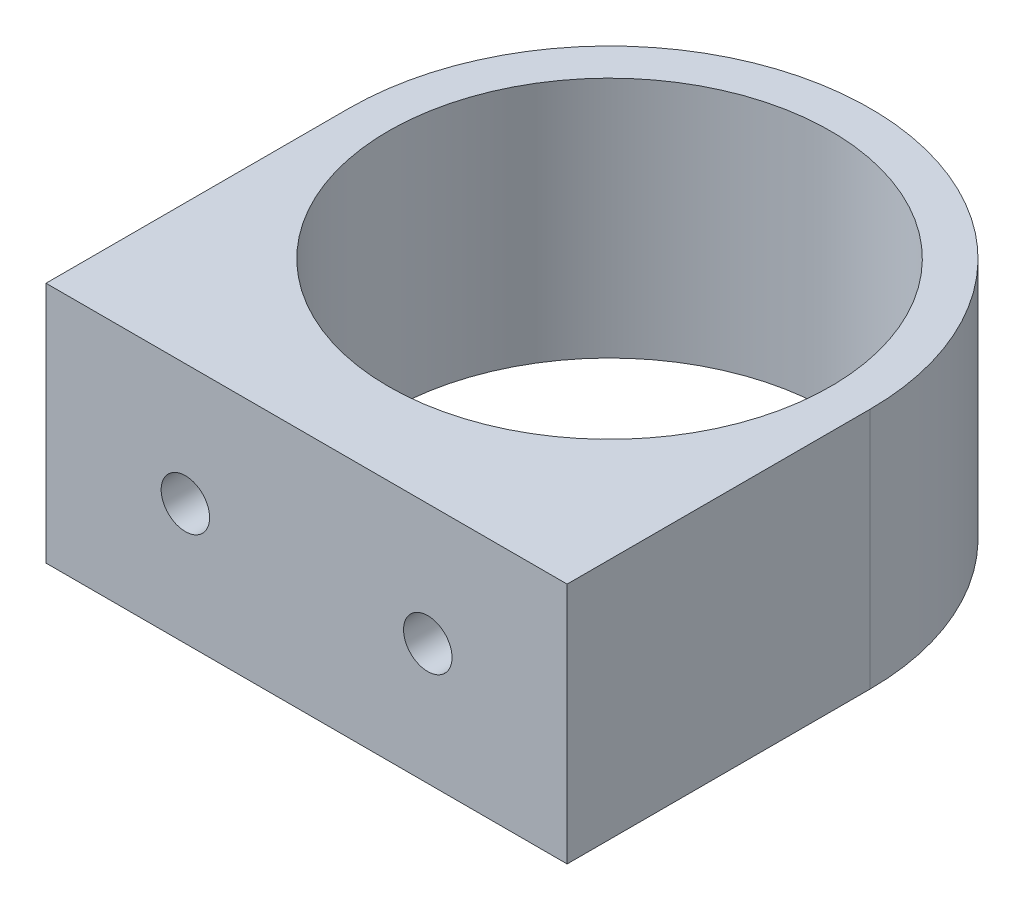
ISO-10303-21;
HEADER;
FILE_DESCRIPTION(('STEP AP214'),'2;1');
FILE_NAME('part.step','',(''),(''),'','','');
FILE_SCHEMA(('AUTOMOTIVE_DESIGN { 1 0 10303 214 1 1 1 1 }'));
ENDSEC;
DATA;
#1=APPLICATION_CONTEXT('core data for automotive mechanical design processes');
#2=APPLICATION_PROTOCOL_DEFINITION('international standard','automotive_design',2000,#1);
#3=PRODUCT_CONTEXT('',#1,'mechanical');
#4=PRODUCT('Part','Part','',(#3));
#5=PRODUCT_RELATED_PRODUCT_CATEGORY('part','',(#4));
#6=PRODUCT_DEFINITION_FORMATION('','',#4);
#7=PRODUCT_DEFINITION_CONTEXT('part definition',#1,'design');
#8=PRODUCT_DEFINITION('design','',#6,#7);
#9=PRODUCT_DEFINITION_SHAPE('','',#8);
#10=(LENGTH_UNIT() NAMED_UNIT(*) SI_UNIT(.MILLI.,.METRE.));
#11=(NAMED_UNIT(*) PLANE_ANGLE_UNIT() SI_UNIT($,.RADIAN.));
#12=(NAMED_UNIT(*) SI_UNIT($,.STERADIAN.) SOLID_ANGLE_UNIT());
#13=UNCERTAINTY_MEASURE_WITH_UNIT(LENGTH_MEASURE(1.E-05),#10,'distance_accuracy_value','');
#14=(GEOMETRIC_REPRESENTATION_CONTEXT(3) GLOBAL_UNCERTAINTY_ASSIGNED_CONTEXT((#13)) GLOBAL_UNIT_ASSIGNED_CONTEXT((#10,
#11,#12)) REPRESENTATION_CONTEXT('',''));
#15=CARTESIAN_POINT('',(0.,0.,0.));
#16=DIRECTION('',(0.,0.,1.));
#17=DIRECTION('',(1.,0.,0.));
#18=AXIS2_PLACEMENT_3D('',#15,#16,#17);
#19=CARTESIAN_POINT('',(21.5,20.,0.));
#20=DIRECTION('',(-1.,0.,0.));
#21=DIRECTION('',(0.,0.,1.));
#22=AXIS2_PLACEMENT_3D('',#19,#20,#21);
#23=PLANE('',#22);
#24=DIRECTION('',(0.,0.,-1.));
#25=VECTOR('',#24,1.);
#26=CARTESIAN_POINT('',(21.5,0.,0.));
#27=LINE('',#26,#25);
#28=CARTESIAN_POINT('',(21.5,0.,25.));
#29=VERTEX_POINT('',#28);
#30=CARTESIAN_POINT('',(21.5,0.,0.));
#31=VERTEX_POINT('',#30);
#32=EDGE_CURVE('E161',#29,#31,#27,.T.);
#33=ORIENTED_EDGE('',*,*,#32,.T.);
#34=DIRECTION('',(0.,-1.,0.));
#35=VECTOR('',#34,1.);
#36=CARTESIAN_POINT('',(21.5,20.,0.));
#37=LINE('',#36,#35);
#38=CARTESIAN_POINT('',(21.5,20.,0.));
#39=VERTEX_POINT('',#38);
#40=EDGE_CURVE('E108',#39,#31,#37,.T.);
#41=ORIENTED_EDGE('',*,*,#40,.F.);
#42=DIRECTION('',(0.,0.,-1.));
#43=VECTOR('',#42,1.);
#44=CARTESIAN_POINT('',(21.5,20.,0.));
#45=LINE('',#44,#43);
#46=CARTESIAN_POINT('',(21.5,20.,25.));
#47=VERTEX_POINT('',#46);
#48=EDGE_CURVE('E188',#47,#39,#45,.T.);
#49=ORIENTED_EDGE('',*,*,#48,.F.);
#50=DIRECTION('',(0.,-1.,0.));
#51=VECTOR('',#50,1.);
#52=CARTESIAN_POINT('',(21.5,20.,25.));
#53=LINE('',#52,#51);
#54=EDGE_CURVE('E164',#47,#29,#53,.T.);
#55=ORIENTED_EDGE('',*,*,#54,.T.);
#56=EDGE_LOOP('',(#33,#41,#49,#55));
#57=FACE_BOUND('',#56,.T.);
#58=ADVANCED_FACE('F50',(#57),#23,.F.);
#59=CARTESIAN_POINT('',(0.,20.,0.));
#60=DIRECTION('',(0.,-1.,0.));
#61=DIRECTION('',(0.,0.,-1.));
#62=AXIS2_PLACEMENT_3D('',#59,#60,#61);
#63=CYLINDRICAL_SURFACE('',#62,21.5);
#64=CARTESIAN_POINT('',(0.,0.,0.));
#65=DIRECTION('',(0.,1.,0.));
#66=DIRECTION('',(0.,0.,1.));
#67=AXIS2_PLACEMENT_3D('',#64,#65,#66);
#68=CIRCLE('',#67,21.5);
#69=CARTESIAN_POINT('',(-21.5,0.,0.));
#70=VERTEX_POINT('',#69);
#71=EDGE_CURVE('E169',#31,#70,#68,.T.);
#72=ORIENTED_EDGE('',*,*,#71,.T.);
#73=DIRECTION('',(0.,-1.,0.));
#74=VECTOR('',#73,1.);
#75=CARTESIAN_POINT('',(-21.5,20.,0.));
#76=LINE('',#75,#74);
#77=CARTESIAN_POINT('',(-21.5,20.,0.));
#78=VERTEX_POINT('',#77);
#79=EDGE_CURVE('E198',#78,#70,#76,.T.);
#80=ORIENTED_EDGE('',*,*,#79,.F.);
#81=CARTESIAN_POINT('',(0.,20.,0.));
#82=DIRECTION('',(0.,1.,0.));
#83=DIRECTION('',(0.,0.,1.));
#84=AXIS2_PLACEMENT_3D('',#81,#82,#83);
#85=CIRCLE('',#84,21.5);
#86=EDGE_CURVE('E203',#39,#78,#85,.T.);
#87=ORIENTED_EDGE('',*,*,#86,.F.);
#88=ORIENTED_EDGE('',*,*,#40,.T.);
#89=EDGE_LOOP('',(#72,#80,#87,#88));
#90=FACE_BOUND('',#89,.T.);
#91=ADVANCED_FACE('F155',(#90),#63,.T.);
#92=CARTESIAN_POINT('',(-21.5,20.,0.));
#93=DIRECTION('',(1.,0.,0.));
#94=DIRECTION('',(0.,0.,-1.));
#95=AXIS2_PLACEMENT_3D('',#92,#93,#94);
#96=PLANE('',#95);
#97=DIRECTION('',(0.,0.,1.));
#98=VECTOR('',#97,1.);
#99=CARTESIAN_POINT('',(-21.5,0.,0.));
#100=LINE('',#99,#98);
#101=CARTESIAN_POINT('',(-21.5,0.,25.));
#102=VERTEX_POINT('',#101);
#103=EDGE_CURVE('E171',#70,#102,#100,.T.);
#104=ORIENTED_EDGE('',*,*,#103,.T.);
#105=DIRECTION('',(0.,-1.,0.));
#106=VECTOR('',#105,1.);
#107=CARTESIAN_POINT('',(-21.5,20.,25.));
#108=LINE('',#107,#106);
#109=CARTESIAN_POINT('',(-21.5,20.,25.));
#110=VERTEX_POINT('',#109);
#111=EDGE_CURVE('E194',#110,#102,#108,.T.);
#112=ORIENTED_EDGE('',*,*,#111,.F.);
#113=DIRECTION('',(0.,0.,1.));
#114=VECTOR('',#113,1.);
#115=CARTESIAN_POINT('',(-21.5,20.,0.));
#116=LINE('',#115,#114);
#117=EDGE_CURVE('E202',#78,#110,#116,.T.);
#118=ORIENTED_EDGE('',*,*,#117,.F.);
#119=ORIENTED_EDGE('',*,*,#79,.T.);
#120=EDGE_LOOP('',(#104,#112,#118,#119));
#121=FACE_BOUND('',#120,.T.);
#122=ADVANCED_FACE('F156',(#121),#96,.F.);
#123=CARTESIAN_POINT('',(0.,20.,25.));
#124=DIRECTION('',(0.,0.,-1.));
#125=DIRECTION('',(-1.,0.,0.));
#126=AXIS2_PLACEMENT_3D('',#123,#124,#125);
#127=PLANE('',#126);
#128=CARTESIAN_POINT('',(-10.,10.,25.));
#129=DIRECTION('',(0.,0.,1.));
#130=DIRECTION('',(1.,0.,0.));
#131=AXIS2_PLACEMENT_3D('',#128,#129,#130);
#132=CIRCLE('',#131,2.);
#133=CARTESIAN_POINT('',(-8.,10.,25.));
#134=VERTEX_POINT('',#133);
#135=EDGE_CURVE('E172',#134,#134,#132,.T.);
#136=ORIENTED_EDGE('',*,*,#135,.F.);
#137=EDGE_LOOP('',(#136));
#138=FACE_BOUND('',#137,.T.);
#139=CARTESIAN_POINT('',(10.,10.,25.));
#140=DIRECTION('',(0.,0.,1.));
#141=DIRECTION('',(1.,0.,0.));
#142=AXIS2_PLACEMENT_3D('',#139,#140,#141);
#143=CIRCLE('',#142,2.);
#144=CARTESIAN_POINT('',(12.,10.,25.));
#145=VERTEX_POINT('',#144);
#146=EDGE_CURVE('E113',#145,#145,#143,.T.);
#147=ORIENTED_EDGE('',*,*,#146,.F.);
#148=EDGE_LOOP('',(#147));
#149=FACE_BOUND('',#148,.T.);
#150=DIRECTION('',(1.,0.,0.));
#151=VECTOR('',#150,1.);
#152=CARTESIAN_POINT('',(0.,0.,25.));
#153=LINE('',#152,#151);
#154=EDGE_CURVE('E181',#102,#29,#153,.T.);
#155=ORIENTED_EDGE('',*,*,#154,.T.);
#156=ORIENTED_EDGE('',*,*,#54,.F.);
#157=DIRECTION('',(1.,0.,0.));
#158=VECTOR('',#157,1.);
#159=CARTESIAN_POINT('',(0.,20.,25.));
#160=LINE('',#159,#158);
#161=EDGE_CURVE('E207',#110,#47,#160,.T.);
#162=ORIENTED_EDGE('',*,*,#161,.F.);
#163=ORIENTED_EDGE('',*,*,#111,.T.);
#164=EDGE_LOOP('',(#155,#156,#162,#163));
#165=FACE_BOUND('',#164,.T.);
#166=ADVANCED_FACE('F219',(#138,#149,#165),#127,.F.);
#167=CARTESIAN_POINT('',(0.,20.,0.));
#168=DIRECTION('',(0.,-1.,0.));
#169=DIRECTION('',(0.,0.,-1.));
#170=AXIS2_PLACEMENT_3D('',#167,#168,#169);
#171=CYLINDRICAL_SURFACE('',#170,18.25);
#172=CARTESIAN_POINT('',(-10.3953114431459,11.9605430020578,15.));
#173=CARTESIAN_POINT('',(-10.3265461641565,11.9744039907809,15.0476631686162));
#174=CARTESIAN_POINT('',(-10.2569497058866,11.9846754894667,15.0951876549097));
#175=CARTESIAN_POINT('',(-10.1165744265156,11.9978462917166,15.1896190036025));
#176=CARTESIAN_POINT('',(-10.0457947487214,12.0007399981712,15.2365253702491));
#177=CARTESIAN_POINT('',(-9.90312958337745,11.9989339218546,15.3296392314445));
#178=CARTESIAN_POINT('',(-9.83123980621342,11.9941795731969,15.3758393087395));
#179=CARTESIAN_POINT('',(-9.68754763613092,11.9767692392693,15.466776286719));
#180=CARTESIAN_POINT('',(-9.61574522399509,11.9641155323886,15.5115136053885));
#181=CARTESIAN_POINT('',(-9.41184161466312,11.9163882214088,15.6366150455931));
#182=CARTESIAN_POINT('',(-9.28054918062681,11.871397402077,15.7148178516367));
#183=CARTESIAN_POINT('',(-9.02655053430678,11.7527009660012,15.8620740169338));
#184=CARTESIAN_POINT('',(-8.90381760105161,11.6790899076496,15.9311565122354));
#185=CARTESIAN_POINT('',(-8.68896687558641,11.5155454068535,16.0492160972148));
#186=CARTESIAN_POINT('',(-8.59495349495237,11.4291662356293,16.099648752381));
#187=CARTESIAN_POINT('',(-8.42313034406409,11.2369500557975,16.1902075892274));
#188=CARTESIAN_POINT('',(-8.34530918560027,11.1311268217763,16.2303410191601));
#189=CARTESIAN_POINT('',(-8.22066900189718,10.9201805372049,16.2937804539733));
#190=CARTESIAN_POINT('',(-8.17097703895513,10.8172310858416,16.3186911527653));
#191=CARTESIAN_POINT('',(-8.08955686551075,10.6027665794171,16.3592071451684));
#192=CARTESIAN_POINT('',(-8.05781421172887,10.4912584935386,16.3748199210831));
#193=CARTESIAN_POINT('',(-8.01617752524773,10.2746281016913,16.3952395219619));
#194=CARTESIAN_POINT('',(-8.00446136141258,10.1699369955412,16.4009483578812));
#195=CARTESIAN_POINT('',(-7.99764631748871,9.95989749509025,16.4042730234892));
#196=CARTESIAN_POINT('',(-8.0025427447262,9.85454929479495,16.4018911386198));
#197=CARTESIAN_POINT('',(-8.02823472193439,9.65018690690835,16.3893298649081));
#198=CARTESIAN_POINT('',(-8.04845063766668,9.55108129728943,16.3794347242781));
#199=CARTESIAN_POINT('',(-8.10319853203673,9.35795771028066,16.352418708213));
#200=CARTESIAN_POINT('',(-8.13773056612113,9.26393975259699,16.3352978047924));
#201=CARTESIAN_POINT('',(-8.22041754368206,9.08169690015703,16.293845467056));
#202=CARTESIAN_POINT('',(-8.26880753684374,8.99360750357044,16.2693892440032));
#203=CARTESIAN_POINT('',(-8.37701643826207,8.8270570018856,16.213937928527));
#204=CARTESIAN_POINT('',(-8.4368379850658,8.74859812651313,16.182941326329));
#205=CARTESIAN_POINT('',(-8.57004939535245,8.59785367829713,16.1128138544837));
#206=CARTESIAN_POINT('',(-8.64407453122409,8.52631832001753,16.0732808976197));
#207=CARTESIAN_POINT('',(-8.80009530101319,8.39671366563371,15.9883930897323));
#208=CARTESIAN_POINT('',(-8.8820932650711,8.33864832316869,15.9430365354541));
#209=CARTESIAN_POINT('',(-9.06073970837854,8.23087413523997,15.8422564395161));
#210=CARTESIAN_POINT('',(-9.15801603621147,8.18273106770225,15.7862749036575));
#211=CARTESIAN_POINT('',(-9.35649629195188,8.10333215235499,15.6694532438167));
#212=CARTESIAN_POINT('',(-9.45770355277906,8.07209098561952,15.6086089484908));
#213=CARTESIAN_POINT('',(-9.67533266435131,8.02296686627688,15.474781846969));
#214=CARTESIAN_POINT('',(-9.79196283357748,8.00745870870104,15.4012696361901));
#215=CARTESIAN_POINT('',(-10.024015941504,7.99677650860665,15.2512504115861));
#216=CARTESIAN_POINT('',(-10.1394400417783,8.00158065492835,15.1747466974534));
#217=CARTESIAN_POINT('',(-10.3008311145224,8.02216829808323,15.0651514679389));
#218=CARTESIAN_POINT('',(-10.3482765473973,8.02997330946246,15.0326012529087));
#219=CARTESIAN_POINT('',(-10.3953114431459,8.03945699794217,15.));
#220=B_SPLINE_CURVE_WITH_KNOTS('',3,(#172,#173,#174,#175,#176,#177,#178,#179,#180,#181,#182,
#183,#184,#185,#186,#187,#188,#189,#190,#191,#192,#193,#194,#195,#196,#197,#198,#199,#200,#201,
#202,#203,#204,#205,#206,#207,#208,#209,#210,#211,#212,#213,#214,#215,#216,#217,#218,#219),
.UNSPECIFIED.,.F.,.F.,(4,2,2,2,2,2,2,2,2,2,2,2,2,2,2,2,2,2,2,2,2,2,2,4),(0.,0.254359573333514,
0.508912057405566,0.765288742812771,1.02159151637382,1.49651868292806,1.96988989203655,
2.37923589600914,2.78829302090042,3.13735621418562,3.48613812544963,3.80105525261911,
4.11588343037128,4.41935997076182,4.72283768653461,5.03180315092635,5.34084001477632,
5.67029218384663,5.99984092976053,6.36475979592852,6.72999512558191,7.14457184187483,
7.55870350273409,7.73278024284565),.UNSPECIFIED.);
#221=CARTESIAN_POINT('',(-10.3953114431459,11.9605430020578,15.));
#222=VERTEX_POINT('',#221);
#223=CARTESIAN_POINT('',(-10.3953114431459,8.03945699794217,15.));
#224=VERTEX_POINT('',#223);
#225=EDGE_CURVE('E11',#222,#224,#220,.T.);
#226=ORIENTED_EDGE('',*,*,#225,.F.);
#227=DIRECTION('',(0.,-1.,0.));
#228=VECTOR('',#227,1.);
#229=CARTESIAN_POINT('',(-10.3953114431459,20.,15.));
#230=LINE('',#229,#228);
#231=EDGE_CURVE('E64',#222,#224,#230,.T.);
#232=ORIENTED_EDGE('',*,*,#231,.T.);
#233=EDGE_LOOP('',(#226,#232));
#234=FACE_BOUND('',#233,.T.);
#235=CARTESIAN_POINT('',(10.3953114431459,8.03945699794217,15.));
#236=CARTESIAN_POINT('',(10.3265461641565,8.02559600921907,15.0476631686162));
#237=CARTESIAN_POINT('',(10.2569497058866,8.01532451053328,15.0951876549097));
#238=CARTESIAN_POINT('',(10.1165744265156,8.00215370828338,15.1896190036025));
#239=CARTESIAN_POINT('',(10.0457947487214,7.99926000182881,15.2365253702491));
#240=CARTESIAN_POINT('',(9.90312958337745,8.00106607814537,15.3296392314445));
#241=CARTESIAN_POINT('',(9.83123980621342,8.00582042680314,15.3758393087395));
#242=CARTESIAN_POINT('',(9.68754763613092,8.02323076073072,15.466776286719));
#243=CARTESIAN_POINT('',(9.61574522399509,8.03588446761137,15.5115136053885));
#244=CARTESIAN_POINT('',(9.41184161466312,8.08361177859124,15.6366150455931));
#245=CARTESIAN_POINT('',(9.28054918062681,8.12860259792298,15.7148178516367));
#246=CARTESIAN_POINT('',(9.02655053430677,8.24729903399884,15.8620740169338));
#247=CARTESIAN_POINT('',(8.90381760105161,8.32091009235042,15.9311565122354));
#248=CARTESIAN_POINT('',(8.68896687558641,8.48445459314648,16.0492160972148));
#249=CARTESIAN_POINT('',(8.59495349495237,8.57083376437073,16.099648752381));
#250=CARTESIAN_POINT('',(8.42313034406409,8.76304994420246,16.1902075892274));
#251=CARTESIAN_POINT('',(8.34530918560027,8.8688731782237,16.2303410191601));
#252=CARTESIAN_POINT('',(8.22066900189718,9.07981946279506,16.2937804539733));
#253=CARTESIAN_POINT('',(8.17097703895512,9.18276891415841,16.3186911527653));
#254=CARTESIAN_POINT('',(8.08955686551075,9.39723342058286,16.3592071451684));
#255=CARTESIAN_POINT('',(8.05781421172887,9.50874150646143,16.3748199210831));
#256=CARTESIAN_POINT('',(8.01617752524772,9.72537189830869,16.3952395219619));
#257=CARTESIAN_POINT('',(8.00446136141258,9.8300630044588,16.4009483578812));
#258=CARTESIAN_POINT('',(7.99764631748871,10.0401025049097,16.4042730234892));
#259=CARTESIAN_POINT('',(8.00254274472619,10.145450705205,16.4018911386198));
#260=CARTESIAN_POINT('',(8.02823472193438,10.3498130930916,16.3893298649081));
#261=CARTESIAN_POINT('',(8.04845063766667,10.4489187027106,16.3794347242781));
#262=CARTESIAN_POINT('',(8.10319853203672,10.6420422897193,16.352418708213));
#263=CARTESIAN_POINT('',(8.13773056612112,10.736060247403,16.3352978047924));
#264=CARTESIAN_POINT('',(8.22041754368206,10.918303099843,16.293845467056));
#265=CARTESIAN_POINT('',(8.26880753684373,11.0063924964296,16.2693892440032));
#266=CARTESIAN_POINT('',(8.37701643826207,11.1729429981144,16.213937928527));
#267=CARTESIAN_POINT('',(8.4368379850658,11.2514018734869,16.182941326329));
#268=CARTESIAN_POINT('',(8.57004939535245,11.4021463217029,16.1128138544837));
#269=CARTESIAN_POINT('',(8.64407453122409,11.4736816799825,16.0732808976197));
#270=CARTESIAN_POINT('',(8.80009530101319,11.6032863343663,15.9883930897323));
#271=CARTESIAN_POINT('',(8.88209326507109,11.6613516768313,15.9430365354541));
#272=CARTESIAN_POINT('',(9.06073970837853,11.76912586476,15.8422564395161));
#273=CARTESIAN_POINT('',(9.15801603621146,11.8172689322978,15.7862749036575));
#274=CARTESIAN_POINT('',(9.35649629195187,11.896667847645,15.6694532438167));
#275=CARTESIAN_POINT('',(9.45770355277906,11.9279090143805,15.6086089484908));
#276=CARTESIAN_POINT('',(9.67533266435131,11.9770331337231,15.474781846969));
#277=CARTESIAN_POINT('',(9.79196283357747,11.992541291299,15.4012696361901));
#278=CARTESIAN_POINT('',(10.024015941504,12.0032234913934,15.2512504115861));
#279=CARTESIAN_POINT('',(10.1394400417783,11.9984193450716,15.1747466974534));
#280=CARTESIAN_POINT('',(10.3008311145224,11.9778317019168,15.0651514679389));
#281=CARTESIAN_POINT('',(10.3482765473973,11.9700266905375,15.0326012529087));
#282=CARTESIAN_POINT('',(10.3953114431459,11.9605430020578,15.));
#283=B_SPLINE_CURVE_WITH_KNOTS('',3,(#235,#236,#237,#238,#239,#240,#241,#242,#243,#244,#245,
#246,#247,#248,#249,#250,#251,#252,#253,#254,#255,#256,#257,#258,#259,#260,#261,#262,#263,#264,
#265,#266,#267,#268,#269,#270,#271,#272,#273,#274,#275,#276,#277,#278,#279,#280,#281,#282),
.UNSPECIFIED.,.F.,.F.,(4,2,2,2,2,2,2,2,2,2,2,2,2,2,2,2,2,2,2,2,2,2,2,4),(0.,0.254359573333515,
0.508912057405565,0.76528874281277,1.02159151637382,1.49651868292806,1.96988989203655,
2.37923589600915,2.78829302090043,3.13735621418562,3.48613812544963,3.80105525261911,
4.11588343037128,4.41935997076182,4.72283768653461,5.03180315092635,5.34084001477633,
5.67029218384663,5.99984092976053,6.36475979592853,6.72999512558191,7.14457184187484,
7.55870350273409,7.73278024284565),.UNSPECIFIED.);
#284=CARTESIAN_POINT('',(10.3953114431459,8.03945699794217,15.));
#285=VERTEX_POINT('',#284);
#286=CARTESIAN_POINT('',(10.3953114431459,11.9605430020578,15.));
#287=VERTEX_POINT('',#286);
#288=EDGE_CURVE('E107',#285,#287,#283,.T.);
#289=ORIENTED_EDGE('',*,*,#288,.F.);
#290=DIRECTION('',(0.,-1.,0.));
#291=VECTOR('',#290,1.);
#292=CARTESIAN_POINT('',(10.3953114431459,20.,15.));
#293=LINE('',#292,#291);
#294=EDGE_CURVE('E103',#285,#287,#293,.F.);
#295=ORIENTED_EDGE('',*,*,#294,.T.);
#296=EDGE_LOOP('',(#289,#295));
#297=FACE_BOUND('',#296,.T.);
#298=CARTESIAN_POINT('',(0.,20.,0.));
#299=DIRECTION('',(0.,1.,0.));
#300=DIRECTION('',(0.,0.,1.));
#301=AXIS2_PLACEMENT_3D('',#298,#299,#300);
#302=CIRCLE('',#301,18.25);
#303=CARTESIAN_POINT('',(0.,20.,18.25));
#304=VERTEX_POINT('',#303);
#305=EDGE_CURVE('E177',#304,#304,#302,.T.);
#306=ORIENTED_EDGE('',*,*,#305,.T.);
#307=EDGE_LOOP('',(#306));
#308=FACE_BOUND('',#307,.T.);
#309=CARTESIAN_POINT('',(0.,0.,0.));
#310=DIRECTION('',(0.,1.,0.));
#311=DIRECTION('',(0.,0.,1.));
#312=AXIS2_PLACEMENT_3D('',#309,#310,#311);
#313=CIRCLE('',#312,18.25);
#314=CARTESIAN_POINT('',(0.,0.,18.25));
#315=VERTEX_POINT('',#314);
#316=EDGE_CURVE('E183',#315,#315,#313,.T.);
#317=ORIENTED_EDGE('',*,*,#316,.F.);
#318=EDGE_LOOP('',(#317));
#319=FACE_BOUND('',#318,.T.);
#320=ADVANCED_FACE('F116',(#234,#297,#308,#319),#171,.F.);
#321=CARTESIAN_POINT('',(0.,20.,0.));
#322=DIRECTION('',(0.,1.,0.));
#323=DIRECTION('',(0.,0.,1.));
#324=AXIS2_PLACEMENT_3D('',#321,#322,#323);
#325=PLANE('',#324);
#326=ORIENTED_EDGE('',*,*,#48,.T.);
#327=ORIENTED_EDGE('',*,*,#86,.T.);
#328=ORIENTED_EDGE('',*,*,#117,.T.);
#329=ORIENTED_EDGE('',*,*,#161,.T.);
#330=EDGE_LOOP('',(#326,#327,#328,#329));
#331=FACE_BOUND('',#330,.T.);
#332=ORIENTED_EDGE('',*,*,#305,.F.);
#333=EDGE_LOOP('',(#332));
#334=FACE_BOUND('',#333,.T.);
#335=ADVANCED_FACE('F141',(#331,#334),#325,.T.);
#336=CARTESIAN_POINT('',(0.,0.,0.));
#337=DIRECTION('',(0.,1.,0.));
#338=DIRECTION('',(0.,0.,1.));
#339=AXIS2_PLACEMENT_3D('',#336,#337,#338);
#340=PLANE('',#339);
#341=ORIENTED_EDGE('',*,*,#32,.F.);
#342=ORIENTED_EDGE('',*,*,#154,.F.);
#343=ORIENTED_EDGE('',*,*,#103,.F.);
#344=ORIENTED_EDGE('',*,*,#71,.F.);
#345=EDGE_LOOP('',(#341,#342,#343,#344));
#346=FACE_BOUND('',#345,.T.);
#347=ORIENTED_EDGE('',*,*,#316,.T.);
#348=EDGE_LOOP('',(#347));
#349=FACE_BOUND('',#348,.T.);
#350=ADVANCED_FACE('F139',(#346,#349),#340,.F.);
#351=CARTESIAN_POINT('',(10.,10.,15.));
#352=DIRECTION('',(0.,0.,1.));
#353=DIRECTION('',(1.,0.,0.));
#354=AXIS2_PLACEMENT_3D('',#351,#352,#353);
#355=CYLINDRICAL_SURFACE('',#354,2.);
#356=ORIENTED_EDGE('',*,*,#288,.T.);
#357=CARTESIAN_POINT('',(10.,10.,15.));
#358=DIRECTION('',(0.,0.,1.));
#359=DIRECTION('',(1.,0.,0.));
#360=AXIS2_PLACEMENT_3D('',#357,#358,#359);
#361=CIRCLE('',#360,2.);
#362=EDGE_CURVE('E71',#285,#287,#361,.T.);
#363=ORIENTED_EDGE('',*,*,#362,.F.);
#364=EDGE_LOOP('',(#356,#363));
#365=FACE_BOUND('',#364,.T.);
#366=ORIENTED_EDGE('',*,*,#146,.T.);
#367=EDGE_LOOP('',(#366));
#368=FACE_BOUND('',#367,.T.);
#369=ADVANCED_FACE('F115',(#365,#368),#355,.F.);
#370=CARTESIAN_POINT('',(10.,10.,15.));
#371=DIRECTION('',(0.,0.,1.));
#372=DIRECTION('',(1.,0.,0.));
#373=AXIS2_PLACEMENT_3D('',#370,#371,#372);
#374=PLANE('',#373);
#375=ORIENTED_EDGE('',*,*,#362,.T.);
#376=ORIENTED_EDGE('',*,*,#294,.F.);
#377=EDGE_LOOP('',(#375,#376));
#378=FACE_BOUND('',#377,.T.);
#379=ADVANCED_FACE('F102',(#378),#374,.T.);
#380=CARTESIAN_POINT('',(-10.,10.,15.));
#381=DIRECTION('',(0.,0.,1.));
#382=DIRECTION('',(1.,0.,0.));
#383=AXIS2_PLACEMENT_3D('',#380,#381,#382);
#384=CYLINDRICAL_SURFACE('',#383,2.);
#385=ORIENTED_EDGE('',*,*,#225,.T.);
#386=CARTESIAN_POINT('',(-10.,10.,15.));
#387=DIRECTION('',(0.,0.,1.));
#388=DIRECTION('',(1.,0.,0.));
#389=AXIS2_PLACEMENT_3D('',#386,#387,#388);
#390=CIRCLE('',#389,2.);
#391=EDGE_CURVE('E69',#222,#224,#390,.T.);
#392=ORIENTED_EDGE('',*,*,#391,.F.);
#393=EDGE_LOOP('',(#385,#392));
#394=FACE_BOUND('',#393,.T.);
#395=ORIENTED_EDGE('',*,*,#135,.T.);
#396=EDGE_LOOP('',(#395));
#397=FACE_BOUND('',#396,.T.);
#398=ADVANCED_FACE('F137',(#394,#397),#384,.F.);
#399=CARTESIAN_POINT('',(-10.,10.,15.));
#400=DIRECTION('',(0.,0.,1.));
#401=DIRECTION('',(1.,0.,0.));
#402=AXIS2_PLACEMENT_3D('',#399,#400,#401);
#403=PLANE('',#402);
#404=ORIENTED_EDGE('',*,*,#391,.T.);
#405=ORIENTED_EDGE('',*,*,#231,.F.);
#406=EDGE_LOOP('',(#404,#405));
#407=FACE_BOUND('',#406,.T.);
#408=ADVANCED_FACE('F227',(#407),#403,.T.);
#409=CLOSED_SHELL('',(#58,#91,#122,#166,#320,#335,#350,#369,#379,#398,#408));
#410=MANIFOLD_SOLID_BREP('B2',#409);
#411=ADVANCED_BREP_SHAPE_REPRESENTATION('',(#18,#410),#14);
#412=SHAPE_DEFINITION_REPRESENTATION(#9,#411);
ENDSEC;
END-ISO-10303-21;
